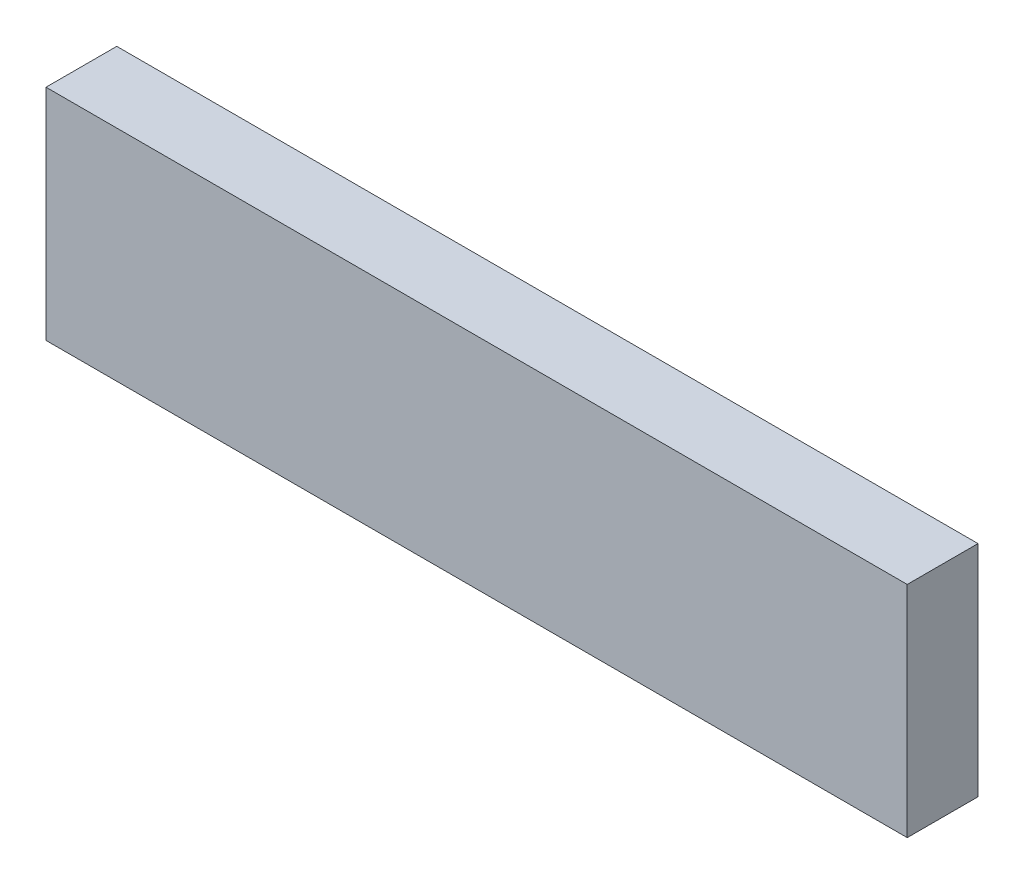
ISO-10303-21;
HEADER;
FILE_DESCRIPTION(('STEP AP214'),'2;1');
FILE_NAME('part.step','',(''),(''),'','','');
FILE_SCHEMA(('AUTOMOTIVE_DESIGN { 1 0 10303 214 1 1 1 1 }'));
ENDSEC;
DATA;
#1=APPLICATION_CONTEXT('core data for automotive mechanical design processes');
#2=APPLICATION_PROTOCOL_DEFINITION('international standard','automotive_design',2000,#1);
#3=PRODUCT_CONTEXT('',#1,'mechanical');
#4=PRODUCT('Part','Part','',(#3));
#5=PRODUCT_RELATED_PRODUCT_CATEGORY('part','',(#4));
#6=PRODUCT_DEFINITION_FORMATION('','',#4);
#7=PRODUCT_DEFINITION_CONTEXT('part definition',#1,'design');
#8=PRODUCT_DEFINITION('design','',#6,#7);
#9=PRODUCT_DEFINITION_SHAPE('','',#8);
#10=(LENGTH_UNIT() NAMED_UNIT(*) SI_UNIT(.MILLI.,.METRE.));
#11=(NAMED_UNIT(*) PLANE_ANGLE_UNIT() SI_UNIT($,.RADIAN.));
#12=(NAMED_UNIT(*) SI_UNIT($,.STERADIAN.) SOLID_ANGLE_UNIT());
#13=UNCERTAINTY_MEASURE_WITH_UNIT(LENGTH_MEASURE(1.E-05),#10,'distance_accuracy_value','');
#14=(GEOMETRIC_REPRESENTATION_CONTEXT(3) GLOBAL_UNCERTAINTY_ASSIGNED_CONTEXT((#13)) GLOBAL_UNIT_ASSIGNED_CONTEXT((#10,
#11,#12)) REPRESENTATION_CONTEXT('',''));
#15=CARTESIAN_POINT('',(0.,0.,0.));
#16=DIRECTION('',(0.,0.,1.));
#17=DIRECTION('',(1.,0.,0.));
#18=AXIS2_PLACEMENT_3D('',#15,#16,#17);
#19=CARTESIAN_POINT('',(0.0127,0.0178,1.));
#20=DIRECTION('',(1.,0.,0.));
#21=DIRECTION('',(0.,0.,-1.));
#22=AXIS2_PLACEMENT_3D('',#19,#20,#21);
#23=PLANE('',#22);
#24=DIRECTION('',(0.,-1.,0.));
#25=VECTOR('',#24,1.);
#26=CARTESIAN_POINT('',(0.0127,0.0178,0.));
#27=LINE('',#26,#25);
#28=CARTESIAN_POINT('',(0.0127,3.1166,0.));
#29=VERTEX_POINT('',#28);
#30=CARTESIAN_POINT('',(0.0127,0.0178,0.));
#31=VERTEX_POINT('',#30);
#32=EDGE_CURVE('E95',#29,#31,#27,.T.);
#33=ORIENTED_EDGE('',*,*,#32,.T.);
#34=DIRECTION('',(0.,0.,-1.));
#35=VECTOR('',#34,1.);
#36=CARTESIAN_POINT('',(0.0127,0.0178,1.));
#37=LINE('',#36,#35);
#38=CARTESIAN_POINT('',(0.0127,0.0178,1.));
#39=VERTEX_POINT('',#38);
#40=EDGE_CURVE('E11',#39,#31,#37,.T.);
#41=ORIENTED_EDGE('',*,*,#40,.F.);
#42=DIRECTION('',(0.,-1.,0.));
#43=VECTOR('',#42,1.);
#44=CARTESIAN_POINT('',(0.0127,0.0178,1.));
#45=LINE('',#44,#43);
#46=CARTESIAN_POINT('',(0.0127,3.1166,1.));
#47=VERTEX_POINT('',#46);
#48=EDGE_CURVE('E83',#47,#39,#45,.T.);
#49=ORIENTED_EDGE('',*,*,#48,.F.);
#50=DIRECTION('',(0.,0.,-1.));
#51=VECTOR('',#50,1.);
#52=CARTESIAN_POINT('',(0.0127,3.1166,1.));
#53=LINE('',#52,#51);
#54=EDGE_CURVE('E91',#47,#29,#53,.T.);
#55=ORIENTED_EDGE('',*,*,#54,.T.);
#56=EDGE_LOOP('',(#33,#41,#49,#55));
#57=FACE_BOUND('',#56,.T.);
#58=ADVANCED_FACE('F32',(#57),#23,.F.);
#59=CARTESIAN_POINT('',(12.1818,0.0178,1.));
#60=DIRECTION('',(0.,1.,0.));
#61=DIRECTION('',(0.,0.,1.));
#62=AXIS2_PLACEMENT_3D('',#59,#60,#61);
#63=PLANE('',#62);
#64=DIRECTION('',(1.,0.,0.));
#65=VECTOR('',#64,1.);
#66=CARTESIAN_POINT('',(12.1818,0.0178,0.));
#67=LINE('',#66,#65);
#68=CARTESIAN_POINT('',(12.1818,0.0178,0.));
#69=VERTEX_POINT('',#68);
#70=EDGE_CURVE('E87',#31,#69,#67,.T.);
#71=ORIENTED_EDGE('',*,*,#70,.T.);
#72=DIRECTION('',(0.,0.,-1.));
#73=VECTOR('',#72,1.);
#74=CARTESIAN_POINT('',(12.1818,0.0178,1.));
#75=LINE('',#74,#73);
#76=CARTESIAN_POINT('',(12.1818,0.0178,1.));
#77=VERTEX_POINT('',#76);
#78=EDGE_CURVE('E40',#77,#69,#75,.T.);
#79=ORIENTED_EDGE('',*,*,#78,.F.);
#80=DIRECTION('',(1.,0.,0.));
#81=VECTOR('',#80,1.);
#82=CARTESIAN_POINT('',(12.1818,0.0178,1.));
#83=LINE('',#82,#81);
#84=EDGE_CURVE('E78',#39,#77,#83,.T.);
#85=ORIENTED_EDGE('',*,*,#84,.F.);
#86=ORIENTED_EDGE('',*,*,#40,.T.);
#87=EDGE_LOOP('',(#71,#79,#85,#86));
#88=FACE_BOUND('',#87,.T.);
#89=ADVANCED_FACE('F86',(#88),#63,.F.);
#90=CARTESIAN_POINT('',(12.1818,3.1166,1.));
#91=DIRECTION('',(-1.,0.,0.));
#92=DIRECTION('',(0.,0.,1.));
#93=AXIS2_PLACEMENT_3D('',#90,#91,#92);
#94=PLANE('',#93);
#95=DIRECTION('',(0.,1.,0.));
#96=VECTOR('',#95,1.);
#97=CARTESIAN_POINT('',(12.1818,3.1166,0.));
#98=LINE('',#97,#96);
#99=CARTESIAN_POINT('',(12.1818,3.1166,0.));
#100=VERTEX_POINT('',#99);
#101=EDGE_CURVE('E65',#69,#100,#98,.T.);
#102=ORIENTED_EDGE('',*,*,#101,.T.);
#103=DIRECTION('',(0.,0.,-1.));
#104=VECTOR('',#103,1.);
#105=CARTESIAN_POINT('',(12.1818,3.1166,1.));
#106=LINE('',#105,#104);
#107=CARTESIAN_POINT('',(12.1818,3.1166,1.));
#108=VERTEX_POINT('',#107);
#109=EDGE_CURVE('E88',#108,#100,#106,.T.);
#110=ORIENTED_EDGE('',*,*,#109,.F.);
#111=DIRECTION('',(0.,1.,0.));
#112=VECTOR('',#111,1.);
#113=CARTESIAN_POINT('',(12.1818,3.1166,1.));
#114=LINE('',#113,#112);
#115=EDGE_CURVE('E81',#77,#108,#114,.T.);
#116=ORIENTED_EDGE('',*,*,#115,.F.);
#117=ORIENTED_EDGE('',*,*,#78,.T.);
#118=EDGE_LOOP('',(#102,#110,#116,#117));
#119=FACE_BOUND('',#118,.T.);
#120=ADVANCED_FACE('F89',(#119),#94,.F.);
#121=CARTESIAN_POINT('',(0.0127,3.1166,1.));
#122=DIRECTION('',(0.,-1.,0.));
#123=DIRECTION('',(0.,0.,-1.));
#124=AXIS2_PLACEMENT_3D('',#121,#122,#123);
#125=PLANE('',#124);
#126=DIRECTION('',(-1.,0.,0.));
#127=VECTOR('',#126,1.);
#128=CARTESIAN_POINT('',(0.0127,3.1166,0.));
#129=LINE('',#128,#127);
#130=EDGE_CURVE('E71',#100,#29,#129,.T.);
#131=ORIENTED_EDGE('',*,*,#130,.T.);
#132=ORIENTED_EDGE('',*,*,#54,.F.);
#133=DIRECTION('',(-1.,0.,0.));
#134=VECTOR('',#133,1.);
#135=CARTESIAN_POINT('',(0.0127,3.1166,1.));
#136=LINE('',#135,#134);
#137=EDGE_CURVE('E48',#108,#47,#136,.T.);
#138=ORIENTED_EDGE('',*,*,#137,.F.);
#139=ORIENTED_EDGE('',*,*,#109,.T.);
#140=EDGE_LOOP('',(#131,#132,#138,#139));
#141=FACE_BOUND('',#140,.T.);
#142=ADVANCED_FACE('F102',(#141),#125,.F.);
#143=CARTESIAN_POINT('',(0.,0.,1.));
#144=DIRECTION('',(0.,0.,-1.));
#145=DIRECTION('',(-1.,0.,0.));
#146=AXIS2_PLACEMENT_3D('',#143,#144,#145);
#147=PLANE('',#146);
#148=ORIENTED_EDGE('',*,*,#48,.T.);
#149=ORIENTED_EDGE('',*,*,#84,.T.);
#150=ORIENTED_EDGE('',*,*,#115,.T.);
#151=ORIENTED_EDGE('',*,*,#137,.T.);
#152=EDGE_LOOP('',(#148,#149,#150,#151));
#153=FACE_BOUND('',#152,.T.);
#154=ADVANCED_FACE('F79',(#153),#147,.F.);
#155=CARTESIAN_POINT('',(0.,0.,0.));
#156=DIRECTION('',(0.,0.,-1.));
#157=DIRECTION('',(-1.,0.,0.));
#158=AXIS2_PLACEMENT_3D('',#155,#156,#157);
#159=PLANE('',#158);
#160=ORIENTED_EDGE('',*,*,#32,.F.);
#161=ORIENTED_EDGE('',*,*,#130,.F.);
#162=ORIENTED_EDGE('',*,*,#101,.F.);
#163=ORIENTED_EDGE('',*,*,#70,.F.);
#164=EDGE_LOOP('',(#160,#161,#162,#163));
#165=FACE_BOUND('',#164,.T.);
#166=ADVANCED_FACE('F105',(#165),#159,.T.);
#167=CLOSED_SHELL('',(#58,#89,#120,#142,#154,#166));
#168=MANIFOLD_SOLID_BREP('B2',#167);
#169=ADVANCED_BREP_SHAPE_REPRESENTATION('',(#18,#168),#14);
#170=SHAPE_DEFINITION_REPRESENTATION(#9,#169);
ENDSEC;
END-ISO-10303-21;
